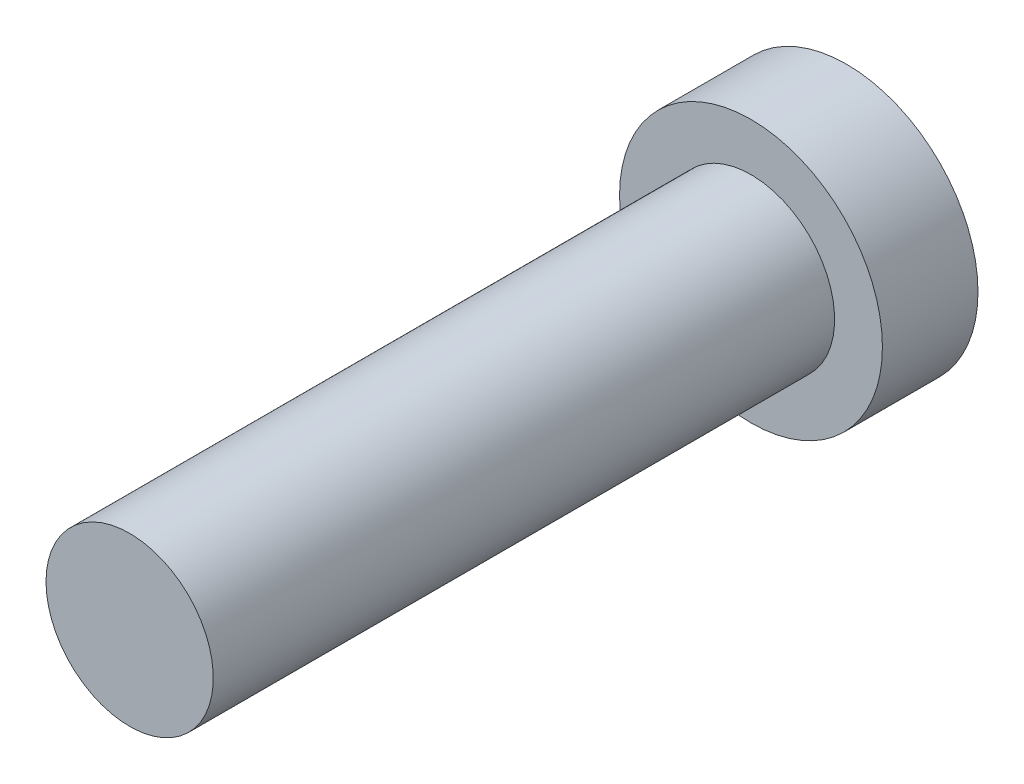
ISO-10303-21;
HEADER;
FILE_DESCRIPTION(('STEP AP214'),'2;1');
FILE_NAME('part.step','',(''),(''),'','','');
FILE_SCHEMA(('AUTOMOTIVE_DESIGN { 1 0 10303 214 1 1 1 1 }'));
ENDSEC;
DATA;
#1=APPLICATION_CONTEXT('core data for automotive mechanical design processes');
#2=APPLICATION_PROTOCOL_DEFINITION('international standard','automotive_design',2000,#1);
#3=PRODUCT_CONTEXT('',#1,'mechanical');
#4=PRODUCT('Part','Part','',(#3));
#5=PRODUCT_RELATED_PRODUCT_CATEGORY('part','',(#4));
#6=PRODUCT_DEFINITION_FORMATION('','',#4);
#7=PRODUCT_DEFINITION_CONTEXT('part definition',#1,'design');
#8=PRODUCT_DEFINITION('design','',#6,#7);
#9=PRODUCT_DEFINITION_SHAPE('','',#8);
#10=(LENGTH_UNIT() NAMED_UNIT(*) SI_UNIT(.MILLI.,.METRE.));
#11=(NAMED_UNIT(*) PLANE_ANGLE_UNIT() SI_UNIT($,.RADIAN.));
#12=(NAMED_UNIT(*) SI_UNIT($,.STERADIAN.) SOLID_ANGLE_UNIT());
#13=UNCERTAINTY_MEASURE_WITH_UNIT(LENGTH_MEASURE(1.E-05),#10,'distance_accuracy_value','');
#14=(GEOMETRIC_REPRESENTATION_CONTEXT(3) GLOBAL_UNCERTAINTY_ASSIGNED_CONTEXT((#13)) GLOBAL_UNIT_ASSIGNED_CONTEXT((#10,
#11,#12)) REPRESENTATION_CONTEXT('',''));
#15=CARTESIAN_POINT('',(0.,0.,0.));
#16=DIRECTION('',(0.,0.,1.));
#17=DIRECTION('',(1.,0.,0.));
#18=AXIS2_PLACEMENT_3D('',#15,#16,#17);
#19=CARTESIAN_POINT('',(0.,0.,2.));
#20=DIRECTION('',(0.,0.,1.));
#21=DIRECTION('',(1.,0.,0.));
#22=AXIS2_PLACEMENT_3D('',#19,#20,#21);
#23=PLANE('',#22);
#24=CARTESIAN_POINT('',(0.,0.,2.));
#25=DIRECTION('',(0.,0.,1.));
#26=DIRECTION('',(1.,0.,0.));
#27=AXIS2_PLACEMENT_3D('',#24,#25,#26);
#28=CIRCLE('',#27,2.75);
#29=CARTESIAN_POINT('',(2.75,0.,2.));
#30=VERTEX_POINT('',#29);
#31=EDGE_CURVE('E10',#30,#30,#28,.T.);
#32=ORIENTED_EDGE('',*,*,#31,.T.);
#33=EDGE_LOOP('',(#32));
#34=FACE_BOUND('',#33,.T.);
#35=CARTESIAN_POINT('',(0.,0.,2.));
#36=DIRECTION('',(0.,0.,1.));
#37=DIRECTION('',(1.,0.,0.));
#38=AXIS2_PLACEMENT_3D('',#35,#36,#37);
#39=CIRCLE('',#38,1.75);
#40=CARTESIAN_POINT('',(-1.75,0.,2.));
#41=VERTEX_POINT('',#40);
#42=EDGE_CURVE('E42',#41,#41,#39,.T.);
#43=ORIENTED_EDGE('',*,*,#42,.F.);
#44=EDGE_LOOP('',(#43));
#45=FACE_BOUND('',#44,.T.);
#46=ADVANCED_FACE('F29',(#34,#45),#23,.T.);
#47=CARTESIAN_POINT('',(0.,0.,2.));
#48=DIRECTION('',(0.,0.,-1.));
#49=DIRECTION('',(-1.,0.,0.));
#50=AXIS2_PLACEMENT_3D('',#47,#48,#49);
#51=CYLINDRICAL_SURFACE('',#50,2.75);
#52=ORIENTED_EDGE('',*,*,#31,.F.);
#53=EDGE_LOOP('',(#52));
#54=FACE_BOUND('',#53,.T.);
#55=CARTESIAN_POINT('',(0.,0.,0.));
#56=DIRECTION('',(0.,0.,1.));
#57=DIRECTION('',(1.,0.,0.));
#58=AXIS2_PLACEMENT_3D('',#55,#56,#57);
#59=CIRCLE('',#58,2.75);
#60=CARTESIAN_POINT('',(2.75,0.,0.));
#61=VERTEX_POINT('',#60);
#62=EDGE_CURVE('E33',#61,#61,#59,.T.);
#63=ORIENTED_EDGE('',*,*,#62,.T.);
#64=EDGE_LOOP('',(#63));
#65=FACE_BOUND('',#64,.T.);
#66=ADVANCED_FACE('F31',(#54,#65),#51,.T.);
#67=CARTESIAN_POINT('',(0.,0.,0.));
#68=DIRECTION('',(0.,0.,1.));
#69=DIRECTION('',(1.,0.,0.));
#70=AXIS2_PLACEMENT_3D('',#67,#68,#69);
#71=PLANE('',#70);
#72=ORIENTED_EDGE('',*,*,#62,.F.);
#73=EDGE_LOOP('',(#72));
#74=FACE_BOUND('',#73,.T.);
#75=ADVANCED_FACE('F53',(#74),#71,.F.);
#76=CARTESIAN_POINT('',(0.,0.,15.));
#77=DIRECTION('',(0.,0.,-1.));
#78=DIRECTION('',(-1.,0.,0.));
#79=AXIS2_PLACEMENT_3D('',#76,#77,#78);
#80=CYLINDRICAL_SURFACE('',#79,1.75);
#81=CARTESIAN_POINT('',(0.,0.,15.));
#82=DIRECTION('',(0.,0.,1.));
#83=DIRECTION('',(1.,0.,0.));
#84=AXIS2_PLACEMENT_3D('',#81,#82,#83);
#85=CIRCLE('',#84,1.75);
#86=CARTESIAN_POINT('',(-1.75,0.,15.));
#87=VERTEX_POINT('',#86);
#88=EDGE_CURVE('E40',#87,#87,#85,.T.);
#89=CARTESIAN_POINT('',(-1.75,0.,15.));
#90=CARTESIAN_POINT('',(-1.75,0.,14.8645833333333));
#91=CARTESIAN_POINT('',(-1.75,0.,14.7291666666667));
#92=CARTESIAN_POINT('',(-1.75,0.,14.4583333333333));
#93=CARTESIAN_POINT('',(-1.75,0.,14.3229166666667));
#94=CARTESIAN_POINT('',(-1.75,0.,14.0520833333333));
#95=CARTESIAN_POINT('',(-1.75,0.,13.9166666666667));
#96=CARTESIAN_POINT('',(-1.75,0.,13.6458333333333));
#97=CARTESIAN_POINT('',(-1.75,0.,13.5104166666667));
#98=CARTESIAN_POINT('',(-1.75,0.,13.2395833333333));
#99=CARTESIAN_POINT('',(-1.75,0.,13.1041666666667));
#100=CARTESIAN_POINT('',(-1.75,0.,12.8333333333333));
#101=CARTESIAN_POINT('',(-1.75,0.,12.6979166666667));
#102=CARTESIAN_POINT('',(-1.75,0.,12.4270833333333));
#103=CARTESIAN_POINT('',(-1.75,0.,12.2916666666667));
#104=CARTESIAN_POINT('',(-1.75,0.,12.0208333333333));
#105=CARTESIAN_POINT('',(-1.75,0.,11.8854166666667));
#106=CARTESIAN_POINT('',(-1.75,0.,11.6145833333333));
#107=CARTESIAN_POINT('',(-1.75,0.,11.4791666666667));
#108=CARTESIAN_POINT('',(-1.75,0.,11.2083333333333));
#109=CARTESIAN_POINT('',(-1.75,0.,11.0729166666667));
#110=CARTESIAN_POINT('',(-1.75,0.,10.8020833333333));
#111=CARTESIAN_POINT('',(-1.75,0.,10.6666666666667));
#112=CARTESIAN_POINT('',(-1.75,0.,10.3958333333333));
#113=CARTESIAN_POINT('',(-1.75,0.,10.2604166666667));
#114=CARTESIAN_POINT('',(-1.75,0.,9.98958333333333));
#115=CARTESIAN_POINT('',(-1.75,0.,9.85416666666667));
#116=CARTESIAN_POINT('',(-1.75,0.,9.58333333333333));
#117=CARTESIAN_POINT('',(-1.75,0.,9.44791666666667));
#118=CARTESIAN_POINT('',(-1.75,0.,9.17708333333333));
#119=CARTESIAN_POINT('',(-1.75,0.,9.04166666666667));
#120=CARTESIAN_POINT('',(-1.75,0.,8.77083333333333));
#121=CARTESIAN_POINT('',(-1.75,0.,8.63541666666667));
#122=CARTESIAN_POINT('',(-1.75,0.,8.36458333333333));
#123=CARTESIAN_POINT('',(-1.75,0.,8.22916666666667));
#124=CARTESIAN_POINT('',(-1.75,0.,7.95833333333333));
#125=CARTESIAN_POINT('',(-1.75,0.,7.82291666666667));
#126=CARTESIAN_POINT('',(-1.75,0.,7.55208333333333));
#127=CARTESIAN_POINT('',(-1.75,0.,7.41666666666667));
#128=CARTESIAN_POINT('',(-1.75,0.,7.14583333333333));
#129=CARTESIAN_POINT('',(-1.75,0.,7.01041666666667));
#130=CARTESIAN_POINT('',(-1.75,0.,6.73958333333333));
#131=CARTESIAN_POINT('',(-1.75,0.,6.60416666666667));
#132=CARTESIAN_POINT('',(-1.75,0.,6.33333333333333));
#133=CARTESIAN_POINT('',(-1.75,0.,6.19791666666667));
#134=CARTESIAN_POINT('',(-1.75,0.,5.92708333333333));
#135=CARTESIAN_POINT('',(-1.75,0.,5.79166666666667));
#136=CARTESIAN_POINT('',(-1.75,0.,5.52083333333333));
#137=CARTESIAN_POINT('',(-1.75,0.,5.38541666666667));
#138=CARTESIAN_POINT('',(-1.75,0.,5.11458333333333));
#139=CARTESIAN_POINT('',(-1.75,0.,4.97916666666667));
#140=CARTESIAN_POINT('',(-1.75,0.,4.70833333333333));
#141=CARTESIAN_POINT('',(-1.75,0.,4.57291666666667));
#142=CARTESIAN_POINT('',(-1.75,0.,4.30208333333333));
#143=CARTESIAN_POINT('',(-1.75,0.,4.16666666666667));
#144=CARTESIAN_POINT('',(-1.75,0.,3.89583333333333));
#145=CARTESIAN_POINT('',(-1.75,0.,3.76041666666667));
#146=CARTESIAN_POINT('',(-1.75,0.,3.48958333333333));
#147=CARTESIAN_POINT('',(-1.75,0.,3.35416666666667));
#148=CARTESIAN_POINT('',(-1.75,0.,3.08333333333333));
#149=CARTESIAN_POINT('',(-1.75,0.,2.94791666666667));
#150=CARTESIAN_POINT('',(-1.75,0.,2.67708333333333));
#151=CARTESIAN_POINT('',(-1.75,0.,2.54166666666667));
#152=CARTESIAN_POINT('',(-1.75,0.,2.27083333333333));
#153=CARTESIAN_POINT('',(-1.75,0.,2.13541666666667));
#154=CARTESIAN_POINT('',(-1.75,0.,2.));
#155=B_SPLINE_CURVE_WITH_KNOTS('',3,(#89,#90,#91,#92,#93,#94,#95,#96,#97,#98,#99,#100,#101,#102,
#103,#104,#105,#106,#107,#108,#109,#110,#111,#112,#113,#114,#115,#116,#117,#118,#119,#120,#121,
#122,#123,#124,#125,#126,#127,#128,#129,#130,#131,#132,#133,#134,#135,#136,#137,#138,#139,#140,
#141,#142,#143,#144,#145,#146,#147,#148,#149,#150,#151,#152,#153,#154),.UNSPECIFIED.,.F.,.F.,(4,
2,2,2,2,2,2,2,2,2,2,2,2,2,2,2,2,2,2,2,2,2,2,2,2,2,2,2,2,2,2,2,4),(0.,0.406249999999999,
0.812499999999999,1.21875,1.625,2.03125,2.4375,2.84375,3.25,3.65625,4.0625,4.46875,4.875,
5.28125,5.6875,6.09375,6.5,6.90625,7.3125,7.71875,8.125,8.53125,8.9375,9.34375,9.75,10.15625,
10.5625,10.96875,11.375,11.78125,12.1875,12.59375,13.),.UNSPECIFIED.);
#156=EDGE_CURVE('BSEAM50',#87,#41,#155,.T.);
#157=ORIENTED_EDGE('',*,*,#88,.F.);
#158=ORIENTED_EDGE('',*,*,#42,.T.);
#159=ORIENTED_EDGE('',*,*,#156,.T.);
#160=ORIENTED_EDGE('',*,*,#156,.F.);
#161=EDGE_LOOP('',(#157,#159,#158,#160));
#162=FACE_BOUND('',#161,.T.);
#163=ADVANCED_FACE('F50',(#162),#80,.T.);
#164=CARTESIAN_POINT('',(0.,0.,15.));
#165=DIRECTION('',(0.,0.,1.));
#166=DIRECTION('',(1.,0.,0.));
#167=AXIS2_PLACEMENT_3D('',#164,#165,#166);
#168=PLANE('',#167);
#169=ORIENTED_EDGE('',*,*,#88,.T.);
#170=EDGE_LOOP('',(#169));
#171=FACE_BOUND('',#170,.T.);
#172=ADVANCED_FACE('F48',(#171),#168,.T.);
#173=CLOSED_SHELL('',(#46,#66,#75,#163,#172));
#174=MANIFOLD_SOLID_BREP('B2',#173);
#175=ADVANCED_BREP_SHAPE_REPRESENTATION('',(#18,#174),#14);
#176=SHAPE_DEFINITION_REPRESENTATION(#9,#175);
ENDSEC;
END-ISO-10303-21;
